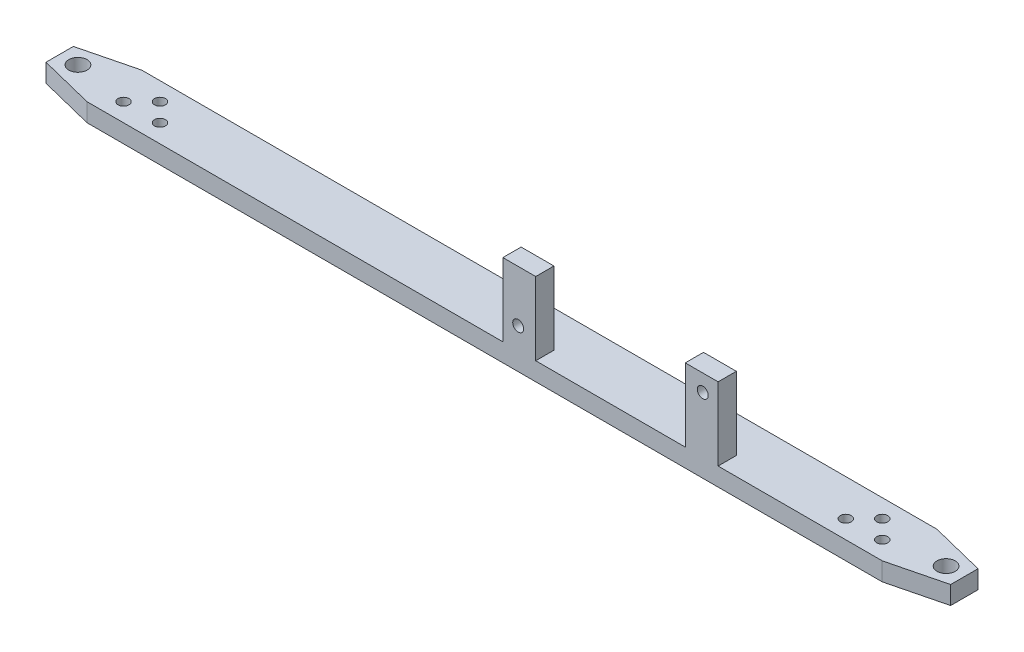
ISO-10303-21;
HEADER;
FILE_DESCRIPTION(('STEP AP214'),'2;1');
FILE_NAME('part.step','',(''),(''),'','','');
FILE_SCHEMA(('AUTOMOTIVE_DESIGN { 1 0 10303 214 1 1 1 1 }'));
ENDSEC;
DATA;
#1=APPLICATION_CONTEXT('core data for automotive mechanical design processes');
#2=APPLICATION_PROTOCOL_DEFINITION('international standard','automotive_design',2000,#1);
#3=PRODUCT_CONTEXT('',#1,'mechanical');
#4=PRODUCT('Part','Part','',(#3));
#5=PRODUCT_RELATED_PRODUCT_CATEGORY('part','',(#4));
#6=PRODUCT_DEFINITION_FORMATION('','',#4);
#7=PRODUCT_DEFINITION_CONTEXT('part definition',#1,'design');
#8=PRODUCT_DEFINITION('design','',#6,#7);
#9=PRODUCT_DEFINITION_SHAPE('','',#8);
#10=(LENGTH_UNIT() NAMED_UNIT(*) SI_UNIT(.MILLI.,.METRE.));
#11=(NAMED_UNIT(*) PLANE_ANGLE_UNIT() SI_UNIT($,.RADIAN.));
#12=(NAMED_UNIT(*) SI_UNIT($,.STERADIAN.) SOLID_ANGLE_UNIT());
#13=UNCERTAINTY_MEASURE_WITH_UNIT(LENGTH_MEASURE(1.E-05),#10,'distance_accuracy_value','');
#14=(GEOMETRIC_REPRESENTATION_CONTEXT(3) GLOBAL_UNCERTAINTY_ASSIGNED_CONTEXT((#13)) GLOBAL_UNIT_ASSIGNED_CONTEXT((#10,
#11,#12)) REPRESENTATION_CONTEXT('',''));
#15=CARTESIAN_POINT('',(0.,0.,0.));
#16=DIRECTION('',(0.,0.,1.));
#17=DIRECTION('',(1.,0.,0.));
#18=AXIS2_PLACEMENT_3D('',#15,#16,#17);
#19=CARTESIAN_POINT('',(0.,5.,0.));
#20=DIRECTION('',(0.,1.,0.));
#21=DIRECTION('',(0.,0.,1.));
#22=AXIS2_PLACEMENT_3D('',#19,#20,#21);
#23=PLANE('',#22);
#24=CARTESIAN_POINT('',(155.401716837224,5.,-13.569100723122));
#25=DIRECTION('',(0.,1.,0.));
#26=DIRECTION('',(0.,0.,1.));
#27=AXIS2_PLACEMENT_3D('',#24,#25,#26);
#28=CIRCLE('',#27,1.5);
#29=CARTESIAN_POINT('',(155.401716837224,5.,-12.069100723122));
#30=VERTEX_POINT('',#29);
#31=EDGE_CURVE('E297',#30,#30,#28,.T.);
#32=ORIENTED_EDGE('',*,*,#31,.F.);
#33=EDGE_LOOP('',(#32));
#34=FACE_BOUND('',#33,.T.);
#35=CARTESIAN_POINT('',(160.401716837224,5.,-8.56910072312204));
#36=DIRECTION('',(0.,1.,0.));
#37=DIRECTION('',(0.,0.,1.));
#38=AXIS2_PLACEMENT_3D('',#35,#36,#37);
#39=CIRCLE('',#38,1.5);
#40=CARTESIAN_POINT('',(160.401716837224,5.,-7.06910072312205));
#41=VERTEX_POINT('',#40);
#42=EDGE_CURVE('E303',#41,#41,#39,.T.);
#43=ORIENTED_EDGE('',*,*,#42,.F.);
#44=EDGE_LOOP('',(#43));
#45=FACE_BOUND('',#44,.T.);
#46=CARTESIAN_POINT('',(150.401716837224,5.,-8.56910072312204));
#47=DIRECTION('',(0.,1.,0.));
#48=DIRECTION('',(0.,0.,1.));
#49=AXIS2_PLACEMENT_3D('',#46,#47,#48);
#50=CIRCLE('',#49,1.5);
#51=CARTESIAN_POINT('',(150.401716837224,5.,-7.06910072312205));
#52=VERTEX_POINT('',#51);
#53=EDGE_CURVE('E309',#52,#52,#50,.T.);
#54=ORIENTED_EDGE('',*,*,#53,.F.);
#55=EDGE_LOOP('',(#54));
#56=FACE_BOUND('',#55,.T.);
#57=CARTESIAN_POINT('',(-47.5982831627763,5.,-8.56910072312204));
#58=DIRECTION('',(0.,1.,0.));
#59=DIRECTION('',(0.,0.,1.));
#60=AXIS2_PLACEMENT_3D('',#57,#58,#59);
#61=CIRCLE('',#60,1.5);
#62=CARTESIAN_POINT('',(-47.5982831627763,5.,-7.06910072312204));
#63=VERTEX_POINT('',#62);
#64=EDGE_CURVE('E315',#63,#63,#61,.T.);
#65=ORIENTED_EDGE('',*,*,#64,.F.);
#66=EDGE_LOOP('',(#65));
#67=FACE_BOUND('',#66,.T.);
#68=CARTESIAN_POINT('',(-37.5982831627763,5.,-8.56910072312204));
#69=DIRECTION('',(0.,1.,0.));
#70=DIRECTION('',(0.,0.,1.));
#71=AXIS2_PLACEMENT_3D('',#68,#69,#70);
#72=CIRCLE('',#71,1.5);
#73=CARTESIAN_POINT('',(-37.5982831627763,5.,-7.06910072312204));
#74=VERTEX_POINT('',#73);
#75=EDGE_CURVE('E321',#74,#74,#72,.T.);
#76=ORIENTED_EDGE('',*,*,#75,.F.);
#77=EDGE_LOOP('',(#76));
#78=FACE_BOUND('',#77,.T.);
#79=CARTESIAN_POINT('',(-42.5982831627763,5.,-13.569100723122));
#80=DIRECTION('',(0.,1.,0.));
#81=DIRECTION('',(0.,0.,1.));
#82=AXIS2_PLACEMENT_3D('',#79,#80,#81);
#83=CIRCLE('',#82,1.5);
#84=CARTESIAN_POINT('',(-42.5982831627763,5.,-12.069100723122));
#85=VERTEX_POINT('',#84);
#86=EDGE_CURVE('E327',#85,#85,#83,.T.);
#87=ORIENTED_EDGE('',*,*,#86,.F.);
#88=EDGE_LOOP('',(#87));
#89=FACE_BOUND('',#88,.T.);
#90=CARTESIAN_POINT('',(-62.5982831627764,5.,-11.069100723122));
#91=DIRECTION('',(0.,1.,0.));
#92=DIRECTION('',(0.,0.,1.));
#93=AXIS2_PLACEMENT_3D('',#90,#91,#92);
#94=CIRCLE('',#93,2.5);
#95=CARTESIAN_POINT('',(-62.5982831627764,5.,-8.56910072312204));
#96=VERTEX_POINT('',#95);
#97=EDGE_CURVE('E333',#96,#96,#94,.T.);
#98=ORIENTED_EDGE('',*,*,#97,.F.);
#99=EDGE_LOOP('',(#98));
#100=FACE_BOUND('',#99,.T.);
#101=CARTESIAN_POINT('',(175.401716837224,5.,-11.069100723122));
#102=DIRECTION('',(0.,1.,0.));
#103=DIRECTION('',(0.,0.,1.));
#104=AXIS2_PLACEMENT_3D('',#101,#102,#103);
#105=CIRCLE('',#104,2.5);
#106=CARTESIAN_POINT('',(175.401716837224,5.,-8.56910072312204));
#107=VERTEX_POINT('',#106);
#108=EDGE_CURVE('E200',#107,#107,#105,.T.);
#109=ORIENTED_EDGE('',*,*,#108,.F.);
#110=EDGE_LOOP('',(#109));
#111=FACE_BOUND('',#110,.T.);
#112=DIRECTION('',(1.,0.,0.));
#113=VECTOR('',#112,1.);
#114=CARTESIAN_POINT('',(-52.5982831627763,5.,-3.56910072312204));
#115=LINE('',#114,#113);
#116=CARTESIAN_POINT('',(70.4017168372237,5.,-3.56910072312204));
#117=VERTEX_POINT('',#116);
#118=CARTESIAN_POINT('',(111.401716837224,5.,-3.56910072312204));
#119=VERTEX_POINT('',#118);
#120=EDGE_CURVE('E211',#117,#119,#115,.T.);
#121=ORIENTED_EDGE('',*,*,#120,.T.);
#122=DIRECTION('',(0.,0.,1.));
#123=VECTOR('',#122,1.);
#124=CARTESIAN_POINT('',(111.401716837224,5.,-3.56910072312204));
#125=LINE('',#124,#123);
#126=CARTESIAN_POINT('',(111.401716837224,5.,-8.56910072312204));
#127=VERTEX_POINT('',#126);
#128=EDGE_CURVE('E173',#127,#119,#125,.T.);
#129=ORIENTED_EDGE('',*,*,#128,.F.);
#130=DIRECTION('',(-1.,0.,0.));
#131=VECTOR('',#130,1.);
#132=CARTESIAN_POINT('',(111.401716837224,5.,-8.56910072312204));
#133=LINE('',#132,#131);
#134=CARTESIAN_POINT('',(120.401716837224,5.,-8.56910072312204));
#135=VERTEX_POINT('',#134);
#136=EDGE_CURVE('E169',#135,#127,#133,.T.);
#137=ORIENTED_EDGE('',*,*,#136,.F.);
#138=DIRECTION('',(0.,0.,-1.));
#139=VECTOR('',#138,1.);
#140=CARTESIAN_POINT('',(120.401716837224,5.,-3.56910072312204));
#141=LINE('',#140,#139);
#142=CARTESIAN_POINT('',(120.401716837224,5.,-3.56910072312204));
#143=VERTEX_POINT('',#142);
#144=EDGE_CURVE('E292',#143,#135,#141,.T.);
#145=ORIENTED_EDGE('',*,*,#144,.F.);
#146=CARTESIAN_POINT('',(165.401716837224,5.,-3.56910072312204));
#147=VERTEX_POINT('',#146);
#148=EDGE_CURVE('E37',#143,#147,#115,.T.);
#149=ORIENTED_EDGE('',*,*,#148,.T.);
#150=DIRECTION('',(0.970142500145332,0.,-0.242535625036333));
#151=VECTOR('',#150,1.);
#152=CARTESIAN_POINT('',(165.401716837224,5.,-3.56910072312204));
#153=LINE('',#152,#151);
#154=CARTESIAN_POINT('',(180.401716837224,5.,-7.31910072312204));
#155=VERTEX_POINT('',#154);
#156=EDGE_CURVE('E219',#147,#155,#153,.T.);
#157=ORIENTED_EDGE('',*,*,#156,.T.);
#158=DIRECTION('',(0.,0.,-1.));
#159=VECTOR('',#158,1.);
#160=CARTESIAN_POINT('',(180.401716837224,5.,-7.31910072312204));
#161=LINE('',#160,#159);
#162=CARTESIAN_POINT('',(180.401716837224,5.,-14.819100723122));
#163=VERTEX_POINT('',#162);
#164=EDGE_CURVE('E223',#155,#163,#161,.T.);
#165=ORIENTED_EDGE('',*,*,#164,.T.);
#166=DIRECTION('',(-0.970142500145332,0.,-0.242535625036333));
#167=VECTOR('',#166,1.);
#168=CARTESIAN_POINT('',(180.401716837224,5.,-14.819100723122));
#169=LINE('',#168,#167);
#170=CARTESIAN_POINT('',(165.401716837224,5.,-18.569100723122));
#171=VERTEX_POINT('',#170);
#172=EDGE_CURVE('E225',#163,#171,#169,.T.);
#173=ORIENTED_EDGE('',*,*,#172,.T.);
#174=DIRECTION('',(-1.,0.,0.));
#175=VECTOR('',#174,1.);
#176=CARTESIAN_POINT('',(165.401716837224,5.,-18.569100723122));
#177=LINE('',#176,#175);
#178=CARTESIAN_POINT('',(-52.5982831627763,5.,-18.569100723122));
#179=VERTEX_POINT('',#178);
#180=EDGE_CURVE('E227',#171,#179,#177,.T.);
#181=ORIENTED_EDGE('',*,*,#180,.T.);
#182=DIRECTION('',(-0.970142500145333,0.,0.24253562503633));
#183=VECTOR('',#182,1.);
#184=CARTESIAN_POINT('',(-52.5982831627763,5.,-18.569100723122));
#185=LINE('',#184,#183);
#186=CARTESIAN_POINT('',(-67.5982831627764,5.,-14.819100723122));
#187=VERTEX_POINT('',#186);
#188=EDGE_CURVE('E229',#179,#187,#185,.T.);
#189=ORIENTED_EDGE('',*,*,#188,.T.);
#190=DIRECTION('',(0.,0.,1.));
#191=VECTOR('',#190,1.);
#192=CARTESIAN_POINT('',(-67.5982831627764,5.,-14.819100723122));
#193=LINE('',#192,#191);
#194=CARTESIAN_POINT('',(-67.5982831627764,5.,-7.31910072312204));
#195=VERTEX_POINT('',#194);
#196=EDGE_CURVE('E250',#187,#195,#193,.T.);
#197=ORIENTED_EDGE('',*,*,#196,.T.);
#198=DIRECTION('',(0.970142500145332,0.,0.242535625036332));
#199=VECTOR('',#198,1.);
#200=CARTESIAN_POINT('',(-67.5982831627764,5.,-7.31910072312204));
#201=LINE('',#200,#199);
#202=CARTESIAN_POINT('',(-52.5982831627763,5.,-3.56910072312204));
#203=VERTEX_POINT('',#202);
#204=EDGE_CURVE('E217',#195,#203,#201,.T.);
#205=ORIENTED_EDGE('',*,*,#204,.T.);
#206=CARTESIAN_POINT('',(61.4017168372237,5.,-3.56910072312204));
#207=VERTEX_POINT('',#206);
#208=EDGE_CURVE('E213',#203,#207,#115,.T.);
#209=ORIENTED_EDGE('',*,*,#208,.T.);
#210=DIRECTION('',(0.,0.,1.));
#211=VECTOR('',#210,1.);
#212=CARTESIAN_POINT('',(61.4017168372237,5.,-3.56910072312204));
#213=LINE('',#212,#211);
#214=CARTESIAN_POINT('',(61.4017168372237,5.,-8.56910072312204));
#215=VERTEX_POINT('',#214);
#216=EDGE_CURVE('E59',#215,#207,#213,.T.);
#217=ORIENTED_EDGE('',*,*,#216,.F.);
#218=DIRECTION('',(-1.,0.,0.));
#219=VECTOR('',#218,1.);
#220=CARTESIAN_POINT('',(61.4017168372237,5.,-8.56910072312204));
#221=LINE('',#220,#219);
#222=CARTESIAN_POINT('',(70.4017168372237,5.,-8.56910072312204));
#223=VERTEX_POINT('',#222);
#224=EDGE_CURVE('E184',#223,#215,#221,.T.);
#225=ORIENTED_EDGE('',*,*,#224,.F.);
#226=DIRECTION('',(0.,0.,-1.));
#227=VECTOR('',#226,1.);
#228=CARTESIAN_POINT('',(70.4017168372237,5.,-3.56910072312204));
#229=LINE('',#228,#227);
#230=EDGE_CURVE('E176',#117,#223,#229,.T.);
#231=ORIENTED_EDGE('',*,*,#230,.F.);
#232=EDGE_LOOP('',(#121,#129,#137,#145,#149,#157,#165,#173,#181,#189,#197,#205,#209,#217,#225,#231));
#233=FACE_BOUND('',#232,.T.);
#234=ADVANCED_FACE('F33',(#34,#45,#56,#67,#78,#89,#100,#111,#233),#23,.T.);
#235=CARTESIAN_POINT('',(-67.5982831627764,5.,-14.819100723122));
#236=DIRECTION('',(1.,0.,0.));
#237=DIRECTION('',(0.,0.,-1.));
#238=AXIS2_PLACEMENT_3D('',#235,#236,#237);
#239=PLANE('',#238);
#240=DIRECTION('',(0.,0.,1.));
#241=VECTOR('',#240,1.);
#242=CARTESIAN_POINT('',(-67.5982831627764,0.,-14.819100723122));
#243=LINE('',#242,#241);
#244=CARTESIAN_POINT('',(-67.5982831627764,0.,-14.819100723122));
#245=VERTEX_POINT('',#244);
#246=CARTESIAN_POINT('',(-67.5982831627764,0.,-7.31910072312204));
#247=VERTEX_POINT('',#246);
#248=EDGE_CURVE('E232',#245,#247,#243,.T.);
#249=ORIENTED_EDGE('',*,*,#248,.T.);
#250=DIRECTION('',(0.,-1.,0.));
#251=VECTOR('',#250,1.);
#252=CARTESIAN_POINT('',(-67.5982831627764,5.,-7.31910072312204));
#253=LINE('',#252,#251);
#254=EDGE_CURVE('E11',#195,#247,#253,.T.);
#255=ORIENTED_EDGE('',*,*,#254,.F.);
#256=ORIENTED_EDGE('',*,*,#196,.F.);
#257=DIRECTION('',(0.,-1.,0.));
#258=VECTOR('',#257,1.);
#259=CARTESIAN_POINT('',(-67.5982831627764,5.,-14.819100723122));
#260=LINE('',#259,#258);
#261=EDGE_CURVE('E231',#187,#245,#260,.T.);
#262=ORIENTED_EDGE('',*,*,#261,.T.);
#263=EDGE_LOOP('',(#249,#255,#256,#262));
#264=FACE_BOUND('',#263,.T.);
#265=ADVANCED_FACE('F35',(#264),#239,.F.);
#266=CARTESIAN_POINT('',(-67.5982831627764,5.,-7.31910072312204));
#267=DIRECTION('',(0.242535625036332,0.,-0.970142500145332));
#268=DIRECTION('',(-0.970142500145332,0.,-0.242535625036332));
#269=AXIS2_PLACEMENT_3D('',#266,#267,#268);
#270=PLANE('',#269);
#271=DIRECTION('',(0.970142500145332,0.,0.242535625036332));
#272=VECTOR('',#271,1.);
#273=CARTESIAN_POINT('',(-67.5982831627764,0.,-7.31910072312204));
#274=LINE('',#273,#272);
#275=CARTESIAN_POINT('',(-52.5982831627763,0.,-3.56910072312204));
#276=VERTEX_POINT('',#275);
#277=EDGE_CURVE('E235',#247,#276,#274,.T.);
#278=ORIENTED_EDGE('',*,*,#277,.T.);
#279=DIRECTION('',(0.,-1.,0.));
#280=VECTOR('',#279,1.);
#281=CARTESIAN_POINT('',(-52.5982831627763,5.,-3.56910072312204));
#282=LINE('',#281,#280);
#283=EDGE_CURVE('E43',#203,#276,#282,.T.);
#284=ORIENTED_EDGE('',*,*,#283,.F.);
#285=ORIENTED_EDGE('',*,*,#204,.F.);
#286=ORIENTED_EDGE('',*,*,#254,.T.);
#287=EDGE_LOOP('',(#278,#284,#285,#286));
#288=FACE_BOUND('',#287,.T.);
#289=ADVANCED_FACE('F390',(#288),#270,.F.);
#290=CARTESIAN_POINT('',(-52.5982831627763,5.,-3.56910072312204));
#291=DIRECTION('',(0.,0.,-1.));
#292=DIRECTION('',(-1.,0.,0.));
#293=AXIS2_PLACEMENT_3D('',#290,#291,#292);
#294=PLANE('',#293);
#295=CARTESIAN_POINT('',(116.201716837224,20.4,-3.56910072312204));
#296=DIRECTION('',(0.,0.,1.));
#297=DIRECTION('',(1.,0.,0.));
#298=AXIS2_PLACEMENT_3D('',#295,#296,#297);
#299=CIRCLE('',#298,1.5);
#300=CARTESIAN_POINT('',(117.701716837224,20.4,-3.56910072312204));
#301=VERTEX_POINT('',#300);
#302=EDGE_CURVE('E373',#301,#301,#299,.T.);
#303=ORIENTED_EDGE('',*,*,#302,.F.);
#304=EDGE_LOOP('',(#303));
#305=FACE_BOUND('',#304,.T.);
#306=CARTESIAN_POINT('',(65.6017168372237,10.9,-3.56910072312204));
#307=DIRECTION('',(0.,0.,1.));
#308=DIRECTION('',(1.,0.,0.));
#309=AXIS2_PLACEMENT_3D('',#306,#307,#308);
#310=CIRCLE('',#309,1.5);
#311=CARTESIAN_POINT('',(67.1017168372237,10.9,-3.56910072312204));
#312=VERTEX_POINT('',#311);
#313=EDGE_CURVE('E362',#312,#312,#310,.T.);
#314=ORIENTED_EDGE('',*,*,#313,.F.);
#315=EDGE_LOOP('',(#314));
#316=FACE_BOUND('',#315,.T.);
#317=DIRECTION('',(1.,0.,0.));
#318=VECTOR('',#317,1.);
#319=CARTESIAN_POINT('',(-52.5982831627763,0.,-3.56910072312204));
#320=LINE('',#319,#318);
#321=CARTESIAN_POINT('',(165.401716837224,0.,-3.56910072312204));
#322=VERTEX_POINT('',#321);
#323=EDGE_CURVE('E238',#276,#322,#320,.T.);
#324=ORIENTED_EDGE('',*,*,#323,.T.);
#325=DIRECTION('',(0.,-1.,0.));
#326=VECTOR('',#325,1.);
#327=CARTESIAN_POINT('',(165.401716837224,5.,-3.56910072312204));
#328=LINE('',#327,#326);
#329=EDGE_CURVE('E265',#147,#322,#328,.T.);
#330=ORIENTED_EDGE('',*,*,#329,.F.);
#331=ORIENTED_EDGE('',*,*,#148,.F.);
#332=DIRECTION('',(0.,-1.,0.));
#333=VECTOR('',#332,1.);
#334=CARTESIAN_POINT('',(120.401716837224,25.,-3.56910072312204));
#335=LINE('',#334,#333);
#336=CARTESIAN_POINT('',(120.401716837224,25.,-3.56910072312204));
#337=VERTEX_POINT('',#336);
#338=EDGE_CURVE('E157',#337,#143,#335,.T.);
#339=ORIENTED_EDGE('',*,*,#338,.F.);
#340=DIRECTION('',(1.,0.,0.));
#341=VECTOR('',#340,1.);
#342=CARTESIAN_POINT('',(111.401716837224,25.,-3.56910072312204));
#343=LINE('',#342,#341);
#344=CARTESIAN_POINT('',(111.401716837224,25.,-3.56910072312204));
#345=VERTEX_POINT('',#344);
#346=EDGE_CURVE('E149',#345,#337,#343,.T.);
#347=ORIENTED_EDGE('',*,*,#346,.F.);
#348=DIRECTION('',(0.,-1.,0.));
#349=VECTOR('',#348,1.);
#350=CARTESIAN_POINT('',(111.401716837224,25.,-3.56910072312204));
#351=LINE('',#350,#349);
#352=EDGE_CURVE('E154',#345,#119,#351,.T.);
#353=ORIENTED_EDGE('',*,*,#352,.T.);
#354=ORIENTED_EDGE('',*,*,#120,.F.);
#355=DIRECTION('',(0.,-1.,0.));
#356=VECTOR('',#355,1.);
#357=CARTESIAN_POINT('',(70.4017168372237,25.,-3.56910072312204));
#358=LINE('',#357,#356);
#359=CARTESIAN_POINT('',(70.4017168372237,25.,-3.56910072312204));
#360=VERTEX_POINT('',#359);
#361=EDGE_CURVE('E201',#360,#117,#358,.T.);
#362=ORIENTED_EDGE('',*,*,#361,.F.);
#363=DIRECTION('',(1.,0.,0.));
#364=VECTOR('',#363,1.);
#365=CARTESIAN_POINT('',(61.4017168372237,25.,-3.56910072312204));
#366=LINE('',#365,#364);
#367=CARTESIAN_POINT('',(61.4017168372237,25.,-3.56910072312204));
#368=VERTEX_POINT('',#367);
#369=EDGE_CURVE('E183',#368,#360,#366,.T.);
#370=ORIENTED_EDGE('',*,*,#369,.F.);
#371=DIRECTION('',(0.,-1.,0.));
#372=VECTOR('',#371,1.);
#373=CARTESIAN_POINT('',(61.4017168372237,25.,-3.56910072312204));
#374=LINE('',#373,#372);
#375=EDGE_CURVE('E197',#368,#207,#374,.T.);
#376=ORIENTED_EDGE('',*,*,#375,.T.);
#377=ORIENTED_EDGE('',*,*,#208,.F.);
#378=ORIENTED_EDGE('',*,*,#283,.T.);
#379=EDGE_LOOP('',(#324,#330,#331,#339,#347,#353,#354,#362,#370,#376,#377,#378));
#380=FACE_BOUND('',#379,.T.);
#381=ADVANCED_FACE('F151',(#305,#316,#380),#294,.F.);
#382=CARTESIAN_POINT('',(165.401716837224,5.,-3.56910072312204));
#383=DIRECTION('',(-0.242535625036333,0.,-0.970142500145332));
#384=DIRECTION('',(-0.970142500145332,0.,0.242535625036333));
#385=AXIS2_PLACEMENT_3D('',#382,#383,#384);
#386=PLANE('',#385);
#387=DIRECTION('',(0.970142500145332,0.,-0.242535625036333));
#388=VECTOR('',#387,1.);
#389=CARTESIAN_POINT('',(165.401716837224,0.,-3.56910072312204));
#390=LINE('',#389,#388);
#391=CARTESIAN_POINT('',(180.401716837224,0.,-7.31910072312204));
#392=VERTEX_POINT('',#391);
#393=EDGE_CURVE('E240',#322,#392,#390,.T.);
#394=ORIENTED_EDGE('',*,*,#393,.T.);
#395=DIRECTION('',(0.,-1.,0.));
#396=VECTOR('',#395,1.);
#397=CARTESIAN_POINT('',(180.401716837224,5.,-7.31910072312204));
#398=LINE('',#397,#396);
#399=EDGE_CURVE('E262',#155,#392,#398,.T.);
#400=ORIENTED_EDGE('',*,*,#399,.F.);
#401=ORIENTED_EDGE('',*,*,#156,.F.);
#402=ORIENTED_EDGE('',*,*,#329,.T.);
#403=EDGE_LOOP('',(#394,#400,#401,#402));
#404=FACE_BOUND('',#403,.T.);
#405=ADVANCED_FACE('F282',(#404),#386,.F.);
#406=CARTESIAN_POINT('',(180.401716837224,5.,-7.31910072312204));
#407=DIRECTION('',(-1.,0.,0.));
#408=DIRECTION('',(0.,0.,1.));
#409=AXIS2_PLACEMENT_3D('',#406,#407,#408);
#410=PLANE('',#409);
#411=DIRECTION('',(0.,0.,-1.));
#412=VECTOR('',#411,1.);
#413=CARTESIAN_POINT('',(180.401716837224,0.,-7.31910072312204));
#414=LINE('',#413,#412);
#415=CARTESIAN_POINT('',(180.401716837224,0.,-14.819100723122));
#416=VERTEX_POINT('',#415);
#417=EDGE_CURVE('E242',#392,#416,#414,.T.);
#418=ORIENTED_EDGE('',*,*,#417,.T.);
#419=DIRECTION('',(0.,-1.,0.));
#420=VECTOR('',#419,1.);
#421=CARTESIAN_POINT('',(180.401716837224,5.,-14.819100723122));
#422=LINE('',#421,#420);
#423=EDGE_CURVE('E259',#163,#416,#422,.T.);
#424=ORIENTED_EDGE('',*,*,#423,.F.);
#425=ORIENTED_EDGE('',*,*,#164,.F.);
#426=ORIENTED_EDGE('',*,*,#399,.T.);
#427=EDGE_LOOP('',(#418,#424,#425,#426));
#428=FACE_BOUND('',#427,.T.);
#429=ADVANCED_FACE('F286',(#428),#410,.F.);
#430=CARTESIAN_POINT('',(180.401716837224,5.,-14.819100723122));
#431=DIRECTION('',(-0.242535625036333,0.,0.970142500145332));
#432=DIRECTION('',(0.970142500145332,0.,0.242535625036333));
#433=AXIS2_PLACEMENT_3D('',#430,#431,#432);
#434=PLANE('',#433);
#435=DIRECTION('',(-0.970142500145332,0.,-0.242535625036333));
#436=VECTOR('',#435,1.);
#437=CARTESIAN_POINT('',(180.401716837224,0.,-14.819100723122));
#438=LINE('',#437,#436);
#439=CARTESIAN_POINT('',(165.401716837224,0.,-18.569100723122));
#440=VERTEX_POINT('',#439);
#441=EDGE_CURVE('E244',#416,#440,#438,.T.);
#442=ORIENTED_EDGE('',*,*,#441,.T.);
#443=DIRECTION('',(0.,-1.,0.));
#444=VECTOR('',#443,1.);
#445=CARTESIAN_POINT('',(165.401716837224,5.,-18.569100723122));
#446=LINE('',#445,#444);
#447=EDGE_CURVE('E256',#171,#440,#446,.T.);
#448=ORIENTED_EDGE('',*,*,#447,.F.);
#449=ORIENTED_EDGE('',*,*,#172,.F.);
#450=ORIENTED_EDGE('',*,*,#423,.T.);
#451=EDGE_LOOP('',(#442,#448,#449,#450));
#452=FACE_BOUND('',#451,.T.);
#453=ADVANCED_FACE('F425',(#452),#434,.F.);
#454=CARTESIAN_POINT('',(165.401716837224,5.,-18.569100723122));
#455=DIRECTION('',(0.,0.,1.));
#456=DIRECTION('',(1.,0.,0.));
#457=AXIS2_PLACEMENT_3D('',#454,#455,#456);
#458=PLANE('',#457);
#459=DIRECTION('',(-1.,0.,0.));
#460=VECTOR('',#459,1.);
#461=CARTESIAN_POINT('',(165.401716837224,0.,-18.569100723122));
#462=LINE('',#461,#460);
#463=CARTESIAN_POINT('',(-52.5982831627763,0.,-18.569100723122));
#464=VERTEX_POINT('',#463);
#465=EDGE_CURVE('E246',#440,#464,#462,.T.);
#466=ORIENTED_EDGE('',*,*,#465,.T.);
#467=DIRECTION('',(0.,-1.,0.));
#468=VECTOR('',#467,1.);
#469=CARTESIAN_POINT('',(-52.5982831627763,5.,-18.569100723122));
#470=LINE('',#469,#468);
#471=EDGE_CURVE('E253',#179,#464,#470,.T.);
#472=ORIENTED_EDGE('',*,*,#471,.F.);
#473=ORIENTED_EDGE('',*,*,#180,.F.);
#474=ORIENTED_EDGE('',*,*,#447,.T.);
#475=EDGE_LOOP('',(#466,#472,#473,#474));
#476=FACE_BOUND('',#475,.T.);
#477=ADVANCED_FACE('F421',(#476),#458,.F.);
#478=CARTESIAN_POINT('',(-52.5982831627763,5.,-18.569100723122));
#479=DIRECTION('',(0.24253562503633,0.,0.970142500145333));
#480=DIRECTION('',(0.970142500145333,0.,-0.24253562503633));
#481=AXIS2_PLACEMENT_3D('',#478,#479,#480);
#482=PLANE('',#481);
#483=DIRECTION('',(-0.970142500145333,0.,0.24253562503633));
#484=VECTOR('',#483,1.);
#485=CARTESIAN_POINT('',(-52.5982831627763,0.,-18.569100723122));
#486=LINE('',#485,#484);
#487=EDGE_CURVE('E248',#464,#245,#486,.T.);
#488=ORIENTED_EDGE('',*,*,#487,.T.);
#489=ORIENTED_EDGE('',*,*,#261,.F.);
#490=ORIENTED_EDGE('',*,*,#188,.F.);
#491=ORIENTED_EDGE('',*,*,#471,.T.);
#492=EDGE_LOOP('',(#488,#489,#490,#491));
#493=FACE_BOUND('',#492,.T.);
#494=ADVANCED_FACE('F417',(#493),#482,.F.);
#495=CARTESIAN_POINT('',(0.,0.,0.));
#496=DIRECTION('',(0.,1.,0.));
#497=DIRECTION('',(0.,0.,1.));
#498=AXIS2_PLACEMENT_3D('',#495,#496,#497);
#499=PLANE('',#498);
#500=CARTESIAN_POINT('',(175.401716837224,0.,-11.069100723122));
#501=DIRECTION('',(0.,1.,0.));
#502=DIRECTION('',(0.,0.,1.));
#503=AXIS2_PLACEMENT_3D('',#500,#501,#502);
#504=CIRCLE('',#503,2.5);
#505=CARTESIAN_POINT('',(175.401716837224,0.,-8.56910072312204));
#506=VERTEX_POINT('',#505);
#507=EDGE_CURVE('E336',#506,#506,#504,.T.);
#508=ORIENTED_EDGE('',*,*,#507,.T.);
#509=EDGE_LOOP('',(#508));
#510=FACE_BOUND('',#509,.T.);
#511=CARTESIAN_POINT('',(-62.5982831627764,0.,-11.069100723122));
#512=DIRECTION('',(0.,1.,0.));
#513=DIRECTION('',(0.,0.,1.));
#514=AXIS2_PLACEMENT_3D('',#511,#512,#513);
#515=CIRCLE('',#514,2.5);
#516=CARTESIAN_POINT('',(-62.5982831627764,0.,-8.56910072312204));
#517=VERTEX_POINT('',#516);
#518=EDGE_CURVE('E330',#517,#517,#515,.T.);
#519=ORIENTED_EDGE('',*,*,#518,.T.);
#520=EDGE_LOOP('',(#519));
#521=FACE_BOUND('',#520,.T.);
#522=CARTESIAN_POINT('',(-42.5982831627763,0.,-13.569100723122));
#523=DIRECTION('',(0.,1.,0.));
#524=DIRECTION('',(0.,0.,1.));
#525=AXIS2_PLACEMENT_3D('',#522,#523,#524);
#526=CIRCLE('',#525,1.5);
#527=CARTESIAN_POINT('',(-42.5982831627763,0.,-12.069100723122));
#528=VERTEX_POINT('',#527);
#529=EDGE_CURVE('E324',#528,#528,#526,.T.);
#530=ORIENTED_EDGE('',*,*,#529,.T.);
#531=EDGE_LOOP('',(#530));
#532=FACE_BOUND('',#531,.T.);
#533=CARTESIAN_POINT('',(-37.5982831627763,0.,-8.56910072312204));
#534=DIRECTION('',(0.,1.,0.));
#535=DIRECTION('',(0.,0.,1.));
#536=AXIS2_PLACEMENT_3D('',#533,#534,#535);
#537=CIRCLE('',#536,1.5);
#538=CARTESIAN_POINT('',(-37.5982831627763,0.,-7.06910072312204));
#539=VERTEX_POINT('',#538);
#540=EDGE_CURVE('E318',#539,#539,#537,.T.);
#541=ORIENTED_EDGE('',*,*,#540,.T.);
#542=EDGE_LOOP('',(#541));
#543=FACE_BOUND('',#542,.T.);
#544=CARTESIAN_POINT('',(-47.5982831627763,0.,-8.56910072312204));
#545=DIRECTION('',(0.,1.,0.));
#546=DIRECTION('',(0.,0.,1.));
#547=AXIS2_PLACEMENT_3D('',#544,#545,#546);
#548=CIRCLE('',#547,1.5);
#549=CARTESIAN_POINT('',(-47.5982831627763,0.,-7.06910072312204));
#550=VERTEX_POINT('',#549);
#551=EDGE_CURVE('E312',#550,#550,#548,.T.);
#552=ORIENTED_EDGE('',*,*,#551,.T.);
#553=EDGE_LOOP('',(#552));
#554=FACE_BOUND('',#553,.T.);
#555=CARTESIAN_POINT('',(150.401716837224,0.,-8.56910072312204));
#556=DIRECTION('',(0.,1.,0.));
#557=DIRECTION('',(0.,0.,1.));
#558=AXIS2_PLACEMENT_3D('',#555,#556,#557);
#559=CIRCLE('',#558,1.5);
#560=CARTESIAN_POINT('',(150.401716837224,0.,-7.06910072312205));
#561=VERTEX_POINT('',#560);
#562=EDGE_CURVE('E306',#561,#561,#559,.T.);
#563=ORIENTED_EDGE('',*,*,#562,.T.);
#564=EDGE_LOOP('',(#563));
#565=FACE_BOUND('',#564,.T.);
#566=CARTESIAN_POINT('',(160.401716837224,0.,-8.56910072312204));
#567=DIRECTION('',(0.,1.,0.));
#568=DIRECTION('',(0.,0.,1.));
#569=AXIS2_PLACEMENT_3D('',#566,#567,#568);
#570=CIRCLE('',#569,1.5);
#571=CARTESIAN_POINT('',(160.401716837224,0.,-7.06910072312205));
#572=VERTEX_POINT('',#571);
#573=EDGE_CURVE('E300',#572,#572,#570,.T.);
#574=ORIENTED_EDGE('',*,*,#573,.T.);
#575=EDGE_LOOP('',(#574));
#576=FACE_BOUND('',#575,.T.);
#577=CARTESIAN_POINT('',(155.401716837224,0.,-13.569100723122));
#578=DIRECTION('',(0.,1.,0.));
#579=DIRECTION('',(0.,0.,1.));
#580=AXIS2_PLACEMENT_3D('',#577,#578,#579);
#581=CIRCLE('',#580,1.5);
#582=CARTESIAN_POINT('',(155.401716837224,0.,-12.069100723122));
#583=VERTEX_POINT('',#582);
#584=EDGE_CURVE('E236',#583,#583,#581,.T.);
#585=ORIENTED_EDGE('',*,*,#584,.T.);
#586=EDGE_LOOP('',(#585));
#587=FACE_BOUND('',#586,.T.);
#588=ORIENTED_EDGE('',*,*,#248,.F.);
#589=ORIENTED_EDGE('',*,*,#487,.F.);
#590=ORIENTED_EDGE('',*,*,#465,.F.);
#591=ORIENTED_EDGE('',*,*,#441,.F.);
#592=ORIENTED_EDGE('',*,*,#417,.F.);
#593=ORIENTED_EDGE('',*,*,#393,.F.);
#594=ORIENTED_EDGE('',*,*,#323,.F.);
#595=ORIENTED_EDGE('',*,*,#277,.F.);
#596=EDGE_LOOP('',(#588,#589,#590,#591,#592,#593,#594,#595));
#597=FACE_BOUND('',#596,.T.);
#598=ADVANCED_FACE('F277',(#510,#521,#532,#543,#554,#565,#576,#587,#597),#499,.F.);
#599=CARTESIAN_POINT('',(155.401716837224,0.,-13.569100723122));
#600=DIRECTION('',(0.,1.,0.));
#601=DIRECTION('',(0.,0.,1.));
#602=AXIS2_PLACEMENT_3D('',#599,#600,#601);
#603=CYLINDRICAL_SURFACE('',#602,1.5);
#604=ORIENTED_EDGE('',*,*,#584,.F.);
#605=EDGE_LOOP('',(#604));
#606=FACE_BOUND('',#605,.T.);
#607=ORIENTED_EDGE('',*,*,#31,.T.);
#608=EDGE_LOOP('',(#607));
#609=FACE_BOUND('',#608,.T.);
#610=ADVANCED_FACE('F413',(#606,#609),#603,.F.);
#611=CARTESIAN_POINT('',(160.401716837224,0.,-8.56910072312204));
#612=DIRECTION('',(0.,1.,0.));
#613=DIRECTION('',(0.,0.,1.));
#614=AXIS2_PLACEMENT_3D('',#611,#612,#613);
#615=CYLINDRICAL_SURFACE('',#614,1.5);
#616=ORIENTED_EDGE('',*,*,#573,.F.);
#617=EDGE_LOOP('',(#616));
#618=FACE_BOUND('',#617,.T.);
#619=ORIENTED_EDGE('',*,*,#42,.T.);
#620=EDGE_LOOP('',(#619));
#621=FACE_BOUND('',#620,.T.);
#622=ADVANCED_FACE('F480',(#618,#621),#615,.F.);
#623=CARTESIAN_POINT('',(150.401716837224,0.,-8.56910072312204));
#624=DIRECTION('',(0.,1.,0.));
#625=DIRECTION('',(0.,0.,1.));
#626=AXIS2_PLACEMENT_3D('',#623,#624,#625);
#627=CYLINDRICAL_SURFACE('',#626,1.5);
#628=ORIENTED_EDGE('',*,*,#562,.F.);
#629=EDGE_LOOP('',(#628));
#630=FACE_BOUND('',#629,.T.);
#631=ORIENTED_EDGE('',*,*,#53,.T.);
#632=EDGE_LOOP('',(#631));
#633=FACE_BOUND('',#632,.T.);
#634=ADVANCED_FACE('F487',(#630,#633),#627,.F.);
#635=CARTESIAN_POINT('',(-47.5982831627763,0.,-8.56910072312204));
#636=DIRECTION('',(0.,1.,0.));
#637=DIRECTION('',(0.,0.,1.));
#638=AXIS2_PLACEMENT_3D('',#635,#636,#637);
#639=CYLINDRICAL_SURFACE('',#638,1.5);
#640=ORIENTED_EDGE('',*,*,#551,.F.);
#641=EDGE_LOOP('',(#640));
#642=FACE_BOUND('',#641,.T.);
#643=ORIENTED_EDGE('',*,*,#64,.T.);
#644=EDGE_LOOP('',(#643));
#645=FACE_BOUND('',#644,.T.);
#646=ADVANCED_FACE('F494',(#642,#645),#639,.F.);
#647=CARTESIAN_POINT('',(-37.5982831627763,0.,-8.56910072312204));
#648=DIRECTION('',(0.,1.,0.));
#649=DIRECTION('',(0.,0.,1.));
#650=AXIS2_PLACEMENT_3D('',#647,#648,#649);
#651=CYLINDRICAL_SURFACE('',#650,1.5);
#652=ORIENTED_EDGE('',*,*,#540,.F.);
#653=EDGE_LOOP('',(#652));
#654=FACE_BOUND('',#653,.T.);
#655=ORIENTED_EDGE('',*,*,#75,.T.);
#656=EDGE_LOOP('',(#655));
#657=FACE_BOUND('',#656,.T.);
#658=ADVANCED_FACE('F502',(#654,#657),#651,.F.);
#659=CARTESIAN_POINT('',(-42.5982831627763,0.,-13.569100723122));
#660=DIRECTION('',(0.,1.,0.));
#661=DIRECTION('',(0.,0.,1.));
#662=AXIS2_PLACEMENT_3D('',#659,#660,#661);
#663=CYLINDRICAL_SURFACE('',#662,1.5);
#664=ORIENTED_EDGE('',*,*,#529,.F.);
#665=EDGE_LOOP('',(#664));
#666=FACE_BOUND('',#665,.T.);
#667=ORIENTED_EDGE('',*,*,#86,.T.);
#668=EDGE_LOOP('',(#667));
#669=FACE_BOUND('',#668,.T.);
#670=ADVANCED_FACE('F510',(#666,#669),#663,.F.);
#671=CARTESIAN_POINT('',(-62.5982831627764,0.,-11.069100723122));
#672=DIRECTION('',(0.,1.,0.));
#673=DIRECTION('',(0.,0.,1.));
#674=AXIS2_PLACEMENT_3D('',#671,#672,#673);
#675=CYLINDRICAL_SURFACE('',#674,2.5);
#676=ORIENTED_EDGE('',*,*,#518,.F.);
#677=EDGE_LOOP('',(#676));
#678=FACE_BOUND('',#677,.T.);
#679=ORIENTED_EDGE('',*,*,#97,.T.);
#680=EDGE_LOOP('',(#679));
#681=FACE_BOUND('',#680,.T.);
#682=ADVANCED_FACE('F518',(#678,#681),#675,.F.);
#683=CARTESIAN_POINT('',(175.401716837224,0.,-11.069100723122));
#684=DIRECTION('',(0.,1.,0.));
#685=DIRECTION('',(0.,0.,1.));
#686=AXIS2_PLACEMENT_3D('',#683,#684,#685);
#687=CYLINDRICAL_SURFACE('',#686,2.5);
#688=ORIENTED_EDGE('',*,*,#507,.F.);
#689=EDGE_LOOP('',(#688));
#690=FACE_BOUND('',#689,.T.);
#691=ORIENTED_EDGE('',*,*,#108,.T.);
#692=EDGE_LOOP('',(#691));
#693=FACE_BOUND('',#692,.T.);
#694=ADVANCED_FACE('F526',(#690,#693),#687,.F.);
#695=CARTESIAN_POINT('',(61.4017168372237,25.,-3.56910072312204));
#696=DIRECTION('',(1.,0.,0.));
#697=DIRECTION('',(0.,0.,-1.));
#698=AXIS2_PLACEMENT_3D('',#695,#696,#697);
#699=PLANE('',#698);
#700=ORIENTED_EDGE('',*,*,#216,.T.);
#701=ORIENTED_EDGE('',*,*,#375,.F.);
#702=DIRECTION('',(0.,0.,1.));
#703=VECTOR('',#702,1.);
#704=CARTESIAN_POINT('',(61.4017168372237,25.,-3.56910072312204));
#705=LINE('',#704,#703);
#706=CARTESIAN_POINT('',(61.4017168372237,25.,-8.56910072312204));
#707=VERTEX_POINT('',#706);
#708=EDGE_CURVE('E180',#707,#368,#705,.T.);
#709=ORIENTED_EDGE('',*,*,#708,.F.);
#710=DIRECTION('',(0.,-1.,0.));
#711=VECTOR('',#710,1.);
#712=CARTESIAN_POINT('',(61.4017168372237,25.,-8.56910072312204));
#713=LINE('',#712,#711);
#714=EDGE_CURVE('E190',#707,#215,#713,.T.);
#715=ORIENTED_EDGE('',*,*,#714,.T.);
#716=EDGE_LOOP('',(#700,#701,#709,#715));
#717=FACE_BOUND('',#716,.T.);
#718=ADVANCED_FACE('F348',(#717),#699,.F.);
#719=CARTESIAN_POINT('',(70.4017168372237,25.,-3.56910072312204));
#720=DIRECTION('',(-1.,0.,0.));
#721=DIRECTION('',(0.,0.,1.));
#722=AXIS2_PLACEMENT_3D('',#719,#720,#721);
#723=PLANE('',#722);
#724=ORIENTED_EDGE('',*,*,#230,.T.);
#725=DIRECTION('',(0.,-1.,0.));
#726=VECTOR('',#725,1.);
#727=CARTESIAN_POINT('',(70.4017168372237,25.,-8.56910072312204));
#728=LINE('',#727,#726);
#729=CARTESIAN_POINT('',(70.4017168372237,25.,-8.56910072312204));
#730=VERTEX_POINT('',#729);
#731=EDGE_CURVE('E206',#730,#223,#728,.T.);
#732=ORIENTED_EDGE('',*,*,#731,.F.);
#733=DIRECTION('',(0.,0.,-1.));
#734=VECTOR('',#733,1.);
#735=CARTESIAN_POINT('',(70.4017168372237,25.,-3.56910072312204));
#736=LINE('',#735,#734);
#737=EDGE_CURVE('E186',#360,#730,#736,.T.);
#738=ORIENTED_EDGE('',*,*,#737,.F.);
#739=ORIENTED_EDGE('',*,*,#361,.T.);
#740=EDGE_LOOP('',(#724,#732,#738,#739));
#741=FACE_BOUND('',#740,.T.);
#742=ADVANCED_FACE('F355',(#741),#723,.F.);
#743=CARTESIAN_POINT('',(61.4017168372237,25.,-8.56910072312204));
#744=DIRECTION('',(0.,0.,1.));
#745=DIRECTION('',(1.,0.,0.));
#746=AXIS2_PLACEMENT_3D('',#743,#744,#745);
#747=PLANE('',#746);
#748=CARTESIAN_POINT('',(65.6017168372237,10.9,-8.56910072312204));
#749=DIRECTION('',(0.,0.,1.));
#750=DIRECTION('',(1.,0.,0.));
#751=AXIS2_PLACEMENT_3D('',#748,#749,#750);
#752=CIRCLE('',#751,1.5);
#753=CARTESIAN_POINT('',(67.1017168372237,10.9,-8.56910072312204));
#754=VERTEX_POINT('',#753);
#755=EDGE_CURVE('E358',#754,#754,#752,.T.);
#756=ORIENTED_EDGE('',*,*,#755,.T.);
#757=EDGE_LOOP('',(#756));
#758=FACE_BOUND('',#757,.T.);
#759=ORIENTED_EDGE('',*,*,#224,.T.);
#760=ORIENTED_EDGE('',*,*,#714,.F.);
#761=DIRECTION('',(-1.,0.,0.));
#762=VECTOR('',#761,1.);
#763=CARTESIAN_POINT('',(61.4017168372237,25.,-8.56910072312204));
#764=LINE('',#763,#762);
#765=EDGE_CURVE('E188',#730,#707,#764,.T.);
#766=ORIENTED_EDGE('',*,*,#765,.F.);
#767=ORIENTED_EDGE('',*,*,#731,.T.);
#768=EDGE_LOOP('',(#759,#760,#766,#767));
#769=FACE_BOUND('',#768,.T.);
#770=ADVANCED_FACE('F352',(#758,#769),#747,.F.);
#771=CARTESIAN_POINT('',(0.,25.,0.));
#772=DIRECTION('',(0.,-1.,0.));
#773=DIRECTION('',(0.,0.,-1.));
#774=AXIS2_PLACEMENT_3D('',#771,#772,#773);
#775=PLANE('',#774);
#776=ORIENTED_EDGE('',*,*,#708,.T.);
#777=ORIENTED_EDGE('',*,*,#369,.T.);
#778=ORIENTED_EDGE('',*,*,#737,.T.);
#779=ORIENTED_EDGE('',*,*,#765,.T.);
#780=EDGE_LOOP('',(#776,#777,#778,#779));
#781=FACE_BOUND('',#780,.T.);
#782=ADVANCED_FACE('F553',(#781),#775,.F.);
#783=CARTESIAN_POINT('',(111.401716837224,25.,-3.56910072312204));
#784=DIRECTION('',(1.,0.,0.));
#785=DIRECTION('',(0.,0.,-1.));
#786=AXIS2_PLACEMENT_3D('',#783,#784,#785);
#787=PLANE('',#786);
#788=ORIENTED_EDGE('',*,*,#128,.T.);
#789=ORIENTED_EDGE('',*,*,#352,.F.);
#790=DIRECTION('',(0.,0.,1.));
#791=VECTOR('',#790,1.);
#792=CARTESIAN_POINT('',(111.401716837224,25.,-3.56910072312204));
#793=LINE('',#792,#791);
#794=CARTESIAN_POINT('',(111.401716837224,25.,-8.56910072312204));
#795=VERTEX_POINT('',#794);
#796=EDGE_CURVE('E161',#795,#345,#793,.T.);
#797=ORIENTED_EDGE('',*,*,#796,.F.);
#798=DIRECTION('',(0.,-1.,0.));
#799=VECTOR('',#798,1.);
#800=CARTESIAN_POINT('',(111.401716837224,25.,-8.56910072312204));
#801=LINE('',#800,#799);
#802=EDGE_CURVE('E368',#795,#127,#801,.T.);
#803=ORIENTED_EDGE('',*,*,#802,.T.);
#804=EDGE_LOOP('',(#788,#789,#797,#803));
#805=FACE_BOUND('',#804,.T.);
#806=ADVANCED_FACE('F171',(#805),#787,.F.);
#807=CARTESIAN_POINT('',(120.401716837224,25.,-3.56910072312204));
#808=DIRECTION('',(-1.,0.,0.));
#809=DIRECTION('',(0.,0.,1.));
#810=AXIS2_PLACEMENT_3D('',#807,#808,#809);
#811=PLANE('',#810);
#812=ORIENTED_EDGE('',*,*,#144,.T.);
#813=DIRECTION('',(0.,-1.,0.));
#814=VECTOR('',#813,1.);
#815=CARTESIAN_POINT('',(120.401716837224,25.,-8.56910072312204));
#816=LINE('',#815,#814);
#817=CARTESIAN_POINT('',(120.401716837224,25.,-8.56910072312204));
#818=VERTEX_POINT('',#817);
#819=EDGE_CURVE('E51',#818,#135,#816,.T.);
#820=ORIENTED_EDGE('',*,*,#819,.F.);
#821=DIRECTION('',(0.,0.,-1.));
#822=VECTOR('',#821,1.);
#823=CARTESIAN_POINT('',(120.401716837224,25.,-3.56910072312204));
#824=LINE('',#823,#822);
#825=EDGE_CURVE('E160',#337,#818,#824,.T.);
#826=ORIENTED_EDGE('',*,*,#825,.F.);
#827=ORIENTED_EDGE('',*,*,#338,.T.);
#828=EDGE_LOOP('',(#812,#820,#826,#827));
#829=FACE_BOUND('',#828,.T.);
#830=ADVANCED_FACE('F568',(#829),#811,.F.);
#831=CARTESIAN_POINT('',(111.401716837224,25.,-8.56910072312204));
#832=DIRECTION('',(0.,0.,1.));
#833=DIRECTION('',(1.,0.,0.));
#834=AXIS2_PLACEMENT_3D('',#831,#832,#833);
#835=PLANE('',#834);
#836=CARTESIAN_POINT('',(116.201716837224,20.4,-8.56910072312204));
#837=DIRECTION('',(0.,0.,1.));
#838=DIRECTION('',(1.,0.,0.));
#839=AXIS2_PLACEMENT_3D('',#836,#837,#838);
#840=CIRCLE('',#839,1.5);
#841=CARTESIAN_POINT('',(117.701716837224,20.4,-8.56910072312204));
#842=VERTEX_POINT('',#841);
#843=EDGE_CURVE('E371',#842,#842,#840,.T.);
#844=ORIENTED_EDGE('',*,*,#843,.T.);
#845=EDGE_LOOP('',(#844));
#846=FACE_BOUND('',#845,.T.);
#847=ORIENTED_EDGE('',*,*,#136,.T.);
#848=ORIENTED_EDGE('',*,*,#802,.F.);
#849=DIRECTION('',(-1.,0.,0.));
#850=VECTOR('',#849,1.);
#851=CARTESIAN_POINT('',(111.401716837224,25.,-8.56910072312204));
#852=LINE('',#851,#850);
#853=EDGE_CURVE('E165',#818,#795,#852,.T.);
#854=ORIENTED_EDGE('',*,*,#853,.F.);
#855=ORIENTED_EDGE('',*,*,#819,.T.);
#856=EDGE_LOOP('',(#847,#848,#854,#855));
#857=FACE_BOUND('',#856,.T.);
#858=ADVANCED_FACE('F379',(#846,#857),#835,.F.);
#859=CARTESIAN_POINT('',(0.,25.,0.));
#860=DIRECTION('',(0.,-1.,0.));
#861=DIRECTION('',(0.,0.,-1.));
#862=AXIS2_PLACEMENT_3D('',#859,#860,#861);
#863=PLANE('',#862);
#864=ORIENTED_EDGE('',*,*,#796,.T.);
#865=ORIENTED_EDGE('',*,*,#346,.T.);
#866=ORIENTED_EDGE('',*,*,#825,.T.);
#867=ORIENTED_EDGE('',*,*,#853,.T.);
#868=EDGE_LOOP('',(#864,#865,#866,#867));
#869=FACE_BOUND('',#868,.T.);
#870=ADVANCED_FACE('F164',(#869),#863,.F.);
#871=CARTESIAN_POINT('',(65.6017168372237,10.9,-8.56910072312204));
#872=DIRECTION('',(0.,0.,1.));
#873=DIRECTION('',(1.,0.,0.));
#874=AXIS2_PLACEMENT_3D('',#871,#872,#873);
#875=CYLINDRICAL_SURFACE('',#874,1.5);
#876=ORIENTED_EDGE('',*,*,#755,.F.);
#877=EDGE_LOOP('',(#876));
#878=FACE_BOUND('',#877,.T.);
#879=ORIENTED_EDGE('',*,*,#313,.T.);
#880=EDGE_LOOP('',(#879));
#881=FACE_BOUND('',#880,.T.);
#882=ADVANCED_FACE('F384',(#878,#881),#875,.F.);
#883=CARTESIAN_POINT('',(116.201716837224,20.4,-8.56910072312204));
#884=DIRECTION('',(0.,0.,1.));
#885=DIRECTION('',(1.,0.,0.));
#886=AXIS2_PLACEMENT_3D('',#883,#884,#885);
#887=CYLINDRICAL_SURFACE('',#886,1.5);
#888=ORIENTED_EDGE('',*,*,#843,.F.);
#889=EDGE_LOOP('',(#888));
#890=FACE_BOUND('',#889,.T.);
#891=ORIENTED_EDGE('',*,*,#302,.T.);
#892=EDGE_LOOP('',(#891));
#893=FACE_BOUND('',#892,.T.);
#894=ADVANCED_FACE('F381',(#890,#893),#887,.F.);
#895=CLOSED_SHELL('',(#234,#265,#289,#381,#405,#429,#453,#477,#494,#598,#610,#622,#634,#646,
#658,#670,#682,#694,#718,#742,#770,#782,#806,#830,#858,#870,#882,#894));
#896=MANIFOLD_SOLID_BREP('B2',#895);
#897=ADVANCED_BREP_SHAPE_REPRESENTATION('',(#18,#896),#14);
#898=SHAPE_DEFINITION_REPRESENTATION(#9,#897);
ENDSEC;
END-ISO-10303-21;
